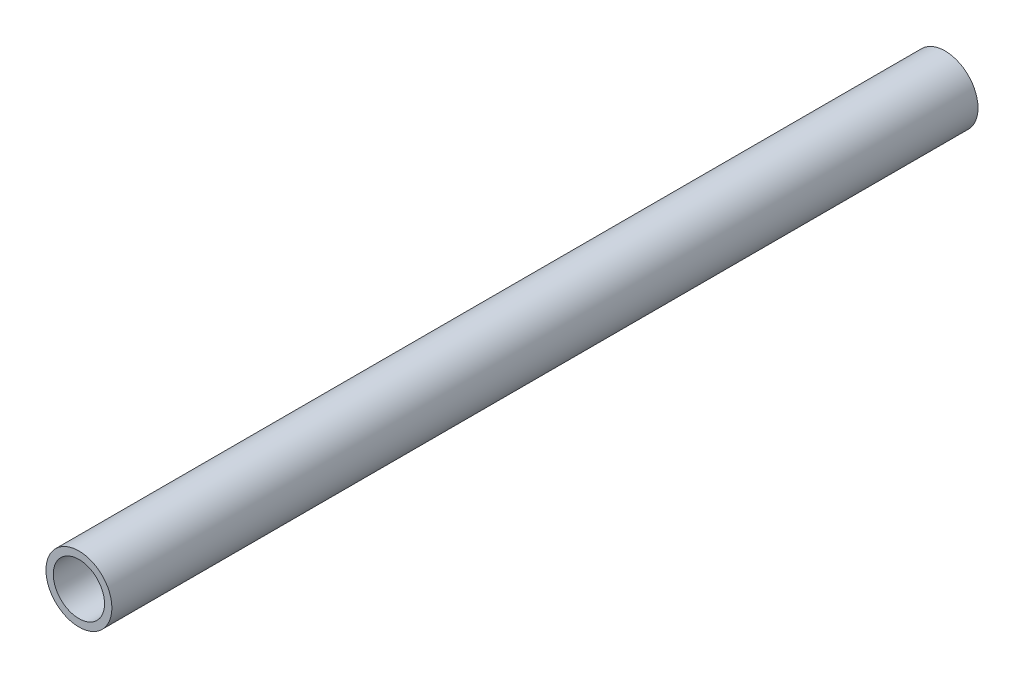
ISO-10303-21;
HEADER;
FILE_DESCRIPTION(('STEP AP214'),'2;1');
FILE_NAME('part.step','',(''),(''),'','','');
FILE_SCHEMA(('AUTOMOTIVE_DESIGN { 1 0 10303 214 1 1 1 1 }'));
ENDSEC;
DATA;
#1=APPLICATION_CONTEXT('core data for automotive mechanical design processes');
#2=APPLICATION_PROTOCOL_DEFINITION('international standard','automotive_design',2000,#1);
#3=PRODUCT_CONTEXT('',#1,'mechanical');
#4=PRODUCT('Part','Part','',(#3));
#5=PRODUCT_RELATED_PRODUCT_CATEGORY('part','',(#4));
#6=PRODUCT_DEFINITION_FORMATION('','',#4);
#7=PRODUCT_DEFINITION_CONTEXT('part definition',#1,'design');
#8=PRODUCT_DEFINITION('design','',#6,#7);
#9=PRODUCT_DEFINITION_SHAPE('','',#8);
#10=(LENGTH_UNIT() NAMED_UNIT(*) SI_UNIT(.MILLI.,.METRE.));
#11=(NAMED_UNIT(*) PLANE_ANGLE_UNIT() SI_UNIT($,.RADIAN.));
#12=(NAMED_UNIT(*) SI_UNIT($,.STERADIAN.) SOLID_ANGLE_UNIT());
#13=UNCERTAINTY_MEASURE_WITH_UNIT(LENGTH_MEASURE(1.E-05),#10,'distance_accuracy_value','');
#14=(GEOMETRIC_REPRESENTATION_CONTEXT(3) GLOBAL_UNCERTAINTY_ASSIGNED_CONTEXT((#13)) GLOBAL_UNIT_ASSIGNED_CONTEXT((#10,
#11,#12)) REPRESENTATION_CONTEXT('',''));
#15=CARTESIAN_POINT('',(0.,0.,0.));
#16=DIRECTION('',(0.,0.,1.));
#17=DIRECTION('',(1.,0.,0.));
#18=AXIS2_PLACEMENT_3D('',#15,#16,#17);
#19=CARTESIAN_POINT('',(0.,0.,236.4));
#20=DIRECTION('',(0.,0.,1.));
#21=DIRECTION('',(1.,0.,0.));
#22=AXIS2_PLACEMENT_3D('',#19,#20,#21);
#23=PLANE('',#22);
#24=CARTESIAN_POINT('',(0.,0.,236.4));
#25=DIRECTION('',(0.,0.,1.));
#26=DIRECTION('',(1.,0.,0.));
#27=AXIS2_PLACEMENT_3D('',#24,#25,#26);
#28=CIRCLE('',#27,9.);
#29=CARTESIAN_POINT('',(9.,0.,236.4));
#30=VERTEX_POINT('',#29);
#31=EDGE_CURVE('E10',#30,#30,#28,.T.);
#32=ORIENTED_EDGE('',*,*,#31,.T.);
#33=EDGE_LOOP('',(#32));
#34=FACE_BOUND('',#33,.T.);
#35=CARTESIAN_POINT('',(0.,0.,236.4));
#36=DIRECTION('',(0.,0.,1.));
#37=DIRECTION('',(1.,0.,0.));
#38=AXIS2_PLACEMENT_3D('',#35,#36,#37);
#39=CIRCLE('',#38,7.);
#40=CARTESIAN_POINT('',(7.,0.,236.4));
#41=VERTEX_POINT('',#40);
#42=EDGE_CURVE('E50',#41,#41,#39,.T.);
#43=ORIENTED_EDGE('',*,*,#42,.F.);
#44=EDGE_LOOP('',(#43));
#45=FACE_BOUND('',#44,.T.);
#46=ADVANCED_FACE('F37',(#34,#45),#23,.T.);
#47=CARTESIAN_POINT('',(0.,0.,0.));
#48=DIRECTION('',(0.,0.,1.));
#49=DIRECTION('',(1.,0.,0.));
#50=AXIS2_PLACEMENT_3D('',#47,#48,#49);
#51=PLANE('',#50);
#52=CARTESIAN_POINT('',(0.,0.,0.));
#53=DIRECTION('',(0.,0.,1.));
#54=DIRECTION('',(1.,0.,0.));
#55=AXIS2_PLACEMENT_3D('',#52,#53,#54);
#56=CIRCLE('',#55,9.);
#57=CARTESIAN_POINT('',(9.,0.,0.));
#58=VERTEX_POINT('',#57);
#59=EDGE_CURVE('E41',#58,#58,#56,.T.);
#60=ORIENTED_EDGE('',*,*,#59,.F.);
#61=EDGE_LOOP('',(#60));
#62=FACE_BOUND('',#61,.T.);
#63=CARTESIAN_POINT('',(0.,0.,0.));
#64=DIRECTION('',(0.,0.,1.));
#65=DIRECTION('',(1.,0.,0.));
#66=AXIS2_PLACEMENT_3D('',#63,#64,#65);
#67=CIRCLE('',#66,7.);
#68=CARTESIAN_POINT('',(7.,0.,0.));
#69=VERTEX_POINT('',#68);
#70=EDGE_CURVE('E52',#69,#69,#67,.T.);
#71=ORIENTED_EDGE('',*,*,#70,.T.);
#72=EDGE_LOOP('',(#71));
#73=FACE_BOUND('',#72,.T.);
#74=ADVANCED_FACE('F64',(#62,#73),#51,.F.);
#75=CARTESIAN_POINT('',(0.,0.,236.4));
#76=DIRECTION('',(0.,0.,-1.));
#77=DIRECTION('',(-1.,0.,0.));
#78=AXIS2_PLACEMENT_3D('',#75,#76,#77);
#79=CYLINDRICAL_SURFACE('',#78,9.);
#80=ORIENTED_EDGE('',*,*,#31,.F.);
#81=EDGE_LOOP('',(#80));
#82=FACE_BOUND('',#81,.T.);
#83=ORIENTED_EDGE('',*,*,#59,.T.);
#84=EDGE_LOOP('',(#83));
#85=FACE_BOUND('',#84,.T.);
#86=ADVANCED_FACE('F39',(#82,#85),#79,.T.);
#87=CARTESIAN_POINT('',(0.,0.,236.4));
#88=DIRECTION('',(0.,0.,-1.));
#89=DIRECTION('',(-1.,0.,0.));
#90=AXIS2_PLACEMENT_3D('',#87,#88,#89);
#91=CYLINDRICAL_SURFACE('',#90,7.);
#92=ORIENTED_EDGE('',*,*,#42,.T.);
#93=EDGE_LOOP('',(#92));
#94=FACE_BOUND('',#93,.T.);
#95=ORIENTED_EDGE('',*,*,#70,.F.);
#96=EDGE_LOOP('',(#95));
#97=FACE_BOUND('',#96,.T.);
#98=ADVANCED_FACE('F60',(#94,#97),#91,.F.);
#99=CLOSED_SHELL('',(#46,#74,#86,#98));
#100=MANIFOLD_SOLID_BREP('B2',#99);
#101=ADVANCED_BREP_SHAPE_REPRESENTATION('',(#18,#100),#14);
#102=SHAPE_DEFINITION_REPRESENTATION(#9,#101);
ENDSEC;
END-ISO-10303-21;
